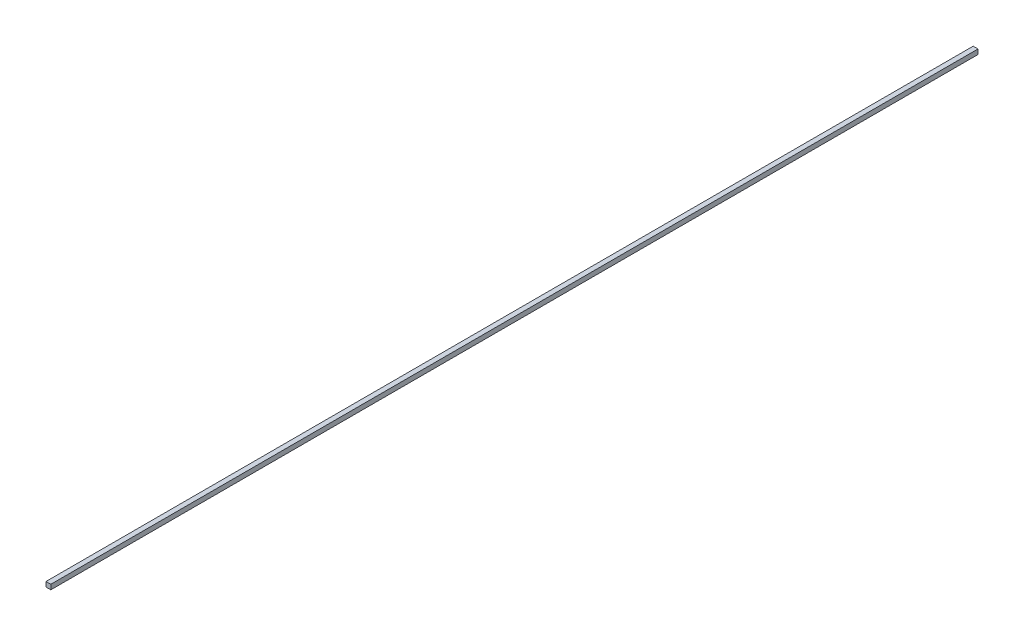
ISO-10303-21;
HEADER;
FILE_DESCRIPTION(('STEP AP214'),'2;1');
FILE_NAME('part.step','',(''),(''),'','','');
FILE_SCHEMA(('AUTOMOTIVE_DESIGN { 1 0 10303 214 1 1 1 1 }'));
ENDSEC;
DATA;
#1=APPLICATION_CONTEXT('core data for automotive mechanical design processes');
#2=APPLICATION_PROTOCOL_DEFINITION('international standard','automotive_design',2000,#1);
#3=PRODUCT_CONTEXT('',#1,'mechanical');
#4=PRODUCT('Part','Part','',(#3));
#5=PRODUCT_RELATED_PRODUCT_CATEGORY('part','',(#4));
#6=PRODUCT_DEFINITION_FORMATION('','',#4);
#7=PRODUCT_DEFINITION_CONTEXT('part definition',#1,'design');
#8=PRODUCT_DEFINITION('design','',#6,#7);
#9=PRODUCT_DEFINITION_SHAPE('','',#8);
#10=(LENGTH_UNIT() NAMED_UNIT(*) SI_UNIT(.MILLI.,.METRE.));
#11=(NAMED_UNIT(*) PLANE_ANGLE_UNIT() SI_UNIT($,.RADIAN.));
#12=(NAMED_UNIT(*) SI_UNIT($,.STERADIAN.) SOLID_ANGLE_UNIT());
#13=UNCERTAINTY_MEASURE_WITH_UNIT(LENGTH_MEASURE(1.E-05),#10,'distance_accuracy_value','');
#14=(GEOMETRIC_REPRESENTATION_CONTEXT(3) GLOBAL_UNCERTAINTY_ASSIGNED_CONTEXT((#13)) GLOBAL_UNIT_ASSIGNED_CONTEXT((#10,
#11,#12)) REPRESENTATION_CONTEXT('',''));
#15=CARTESIAN_POINT('',(0.,0.,0.));
#16=DIRECTION('',(0.,0.,1.));
#17=DIRECTION('',(1.,0.,0.));
#18=AXIS2_PLACEMENT_3D('',#15,#16,#17);
#19=CARTESIAN_POINT('',(3.175,-3.175,609.6));
#20=DIRECTION('',(-1.,0.,0.));
#21=DIRECTION('',(0.,0.,1.));
#22=AXIS2_PLACEMENT_3D('',#19,#20,#21);
#23=PLANE('',#22);
#24=DIRECTION('',(0.,0.,-1.));
#25=VECTOR('',#24,1.);
#26=CARTESIAN_POINT('',(3.175,-3.175,609.6));
#27=LINE('',#26,#25);
#28=CARTESIAN_POINT('',(3.175,-3.175,609.6));
#29=VERTEX_POINT('',#28);
#30=CARTESIAN_POINT('',(3.175,-3.175,-609.6));
#31=VERTEX_POINT('',#30);
#32=EDGE_CURVE('E89',#29,#31,#27,.T.);
#33=ORIENTED_EDGE('',*,*,#32,.T.);
#34=DIRECTION('',(0.,1.,0.));
#35=VECTOR('',#34,1.);
#36=CARTESIAN_POINT('',(3.175,-3.175,-609.6));
#37=LINE('',#36,#35);
#38=CARTESIAN_POINT('',(3.175,3.175,-609.6));
#39=VERTEX_POINT('',#38);
#40=EDGE_CURVE('E84',#31,#39,#37,.T.);
#41=ORIENTED_EDGE('',*,*,#40,.T.);
#42=DIRECTION('',(0.,0.,-1.));
#43=VECTOR('',#42,1.);
#44=CARTESIAN_POINT('',(3.175,3.175,609.6));
#45=LINE('',#44,#43);
#46=CARTESIAN_POINT('',(3.175,3.175,609.6));
#47=VERTEX_POINT('',#46);
#48=EDGE_CURVE('E11',#47,#39,#45,.T.);
#49=ORIENTED_EDGE('',*,*,#48,.F.);
#50=DIRECTION('',(0.,1.,0.));
#51=VECTOR('',#50,1.);
#52=CARTESIAN_POINT('',(3.175,-3.175,609.6));
#53=LINE('',#52,#51);
#54=EDGE_CURVE('E95',#29,#47,#53,.T.);
#55=ORIENTED_EDGE('',*,*,#54,.F.);
#56=EDGE_LOOP('',(#33,#41,#49,#55));
#57=FACE_BOUND('',#56,.T.);
#58=ADVANCED_FACE('F32',(#57),#23,.F.);
#59=CARTESIAN_POINT('',(-3.175,3.175,609.6));
#60=DIRECTION('',(0.,-1.,0.));
#61=DIRECTION('',(0.,0.,-1.));
#62=AXIS2_PLACEMENT_3D('',#59,#60,#61);
#63=PLANE('',#62);
#64=ORIENTED_EDGE('',*,*,#48,.T.);
#65=DIRECTION('',(-1.,0.,0.));
#66=VECTOR('',#65,1.);
#67=CARTESIAN_POINT('',(-3.175,3.175,-609.6));
#68=LINE('',#67,#66);
#69=CARTESIAN_POINT('',(-3.175,3.175,-609.6));
#70=VERTEX_POINT('',#69);
#71=EDGE_CURVE('E74',#39,#70,#68,.T.);
#72=ORIENTED_EDGE('',*,*,#71,.T.);
#73=DIRECTION('',(0.,0.,-1.));
#74=VECTOR('',#73,1.);
#75=CARTESIAN_POINT('',(-3.175,3.175,609.6));
#76=LINE('',#75,#74);
#77=CARTESIAN_POINT('',(-3.175,3.175,609.6));
#78=VERTEX_POINT('',#77);
#79=EDGE_CURVE('E39',#78,#70,#76,.T.);
#80=ORIENTED_EDGE('',*,*,#79,.F.);
#81=DIRECTION('',(-1.,0.,0.));
#82=VECTOR('',#81,1.);
#83=CARTESIAN_POINT('',(-3.175,3.175,609.6));
#84=LINE('',#83,#82);
#85=EDGE_CURVE('E75',#47,#78,#84,.T.);
#86=ORIENTED_EDGE('',*,*,#85,.F.);
#87=EDGE_LOOP('',(#64,#72,#80,#86));
#88=FACE_BOUND('',#87,.T.);
#89=ADVANCED_FACE('F72',(#88),#63,.F.);
#90=CARTESIAN_POINT('',(-3.175,-3.175,609.6));
#91=DIRECTION('',(1.,0.,0.));
#92=DIRECTION('',(0.,1.,0.));
#93=AXIS2_PLACEMENT_3D('',#90,#91,#92);
#94=PLANE('',#93);
#95=ORIENTED_EDGE('',*,*,#79,.T.);
#96=DIRECTION('',(0.,-1.,0.));
#97=VECTOR('',#96,1.);
#98=CARTESIAN_POINT('',(-3.175,-3.175,-609.6));
#99=LINE('',#98,#97);
#100=CARTESIAN_POINT('',(-3.175,-3.175,-609.6));
#101=VERTEX_POINT('',#100);
#102=EDGE_CURVE('E87',#70,#101,#99,.T.);
#103=ORIENTED_EDGE('',*,*,#102,.T.);
#104=DIRECTION('',(0.,0.,-1.));
#105=VECTOR('',#104,1.);
#106=CARTESIAN_POINT('',(-3.175,-3.175,609.6));
#107=LINE('',#106,#105);
#108=CARTESIAN_POINT('',(-3.175,-3.175,609.6));
#109=VERTEX_POINT('',#108);
#110=EDGE_CURVE('E101',#109,#101,#107,.T.);
#111=ORIENTED_EDGE('',*,*,#110,.F.);
#112=DIRECTION('',(0.,-1.,0.));
#113=VECTOR('',#112,1.);
#114=CARTESIAN_POINT('',(-3.175,-3.175,609.6));
#115=LINE('',#114,#113);
#116=EDGE_CURVE('E51',#78,#109,#115,.T.);
#117=ORIENTED_EDGE('',*,*,#116,.F.);
#118=EDGE_LOOP('',(#95,#103,#111,#117));
#119=FACE_BOUND('',#118,.T.);
#120=ADVANCED_FACE('F103',(#119),#94,.F.);
#121=CARTESIAN_POINT('',(-3.175,-3.175,609.6));
#122=DIRECTION('',(0.,1.,0.));
#123=DIRECTION('',(-1.,0.,0.));
#124=AXIS2_PLACEMENT_3D('',#121,#122,#123);
#125=PLANE('',#124);
#126=ORIENTED_EDGE('',*,*,#110,.T.);
#127=DIRECTION('',(1.,0.,0.));
#128=VECTOR('',#127,1.);
#129=CARTESIAN_POINT('',(-3.175,-3.175,-609.6));
#130=LINE('',#129,#128);
#131=EDGE_CURVE('E93',#101,#31,#130,.T.);
#132=ORIENTED_EDGE('',*,*,#131,.T.);
#133=ORIENTED_EDGE('',*,*,#32,.F.);
#134=DIRECTION('',(1.,0.,0.));
#135=VECTOR('',#134,1.);
#136=CARTESIAN_POINT('',(-3.175,-3.175,609.6));
#137=LINE('',#136,#135);
#138=EDGE_CURVE('E46',#109,#29,#137,.T.);
#139=ORIENTED_EDGE('',*,*,#138,.F.);
#140=EDGE_LOOP('',(#126,#132,#133,#139));
#141=FACE_BOUND('',#140,.T.);
#142=ADVANCED_FACE('F105',(#141),#125,.F.);
#143=CARTESIAN_POINT('',(0.,0.,609.6));
#144=DIRECTION('',(0.,0.,-1.));
#145=DIRECTION('',(-1.,0.,0.));
#146=AXIS2_PLACEMENT_3D('',#143,#144,#145);
#147=PLANE('',#146);
#148=ORIENTED_EDGE('',*,*,#54,.T.);
#149=ORIENTED_EDGE('',*,*,#85,.T.);
#150=ORIENTED_EDGE('',*,*,#116,.T.);
#151=ORIENTED_EDGE('',*,*,#138,.T.);
#152=EDGE_LOOP('',(#148,#149,#150,#151));
#153=FACE_BOUND('',#152,.T.);
#154=ADVANCED_FACE('F106',(#153),#147,.F.);
#155=CARTESIAN_POINT('',(0.,0.,-609.6));
#156=DIRECTION('',(0.,0.,-1.));
#157=DIRECTION('',(-1.,0.,0.));
#158=AXIS2_PLACEMENT_3D('',#155,#156,#157);
#159=PLANE('',#158);
#160=ORIENTED_EDGE('',*,*,#40,.F.);
#161=ORIENTED_EDGE('',*,*,#131,.F.);
#162=ORIENTED_EDGE('',*,*,#102,.F.);
#163=ORIENTED_EDGE('',*,*,#71,.F.);
#164=EDGE_LOOP('',(#160,#161,#162,#163));
#165=FACE_BOUND('',#164,.T.);
#166=ADVANCED_FACE('F82',(#165),#159,.T.);
#167=CLOSED_SHELL('',(#58,#89,#120,#142,#154,#166));
#168=MANIFOLD_SOLID_BREP('B2',#167);
#169=ADVANCED_BREP_SHAPE_REPRESENTATION('',(#18,#168),#14);
#170=SHAPE_DEFINITION_REPRESENTATION(#9,#169);
ENDSEC;
END-ISO-10303-21;
